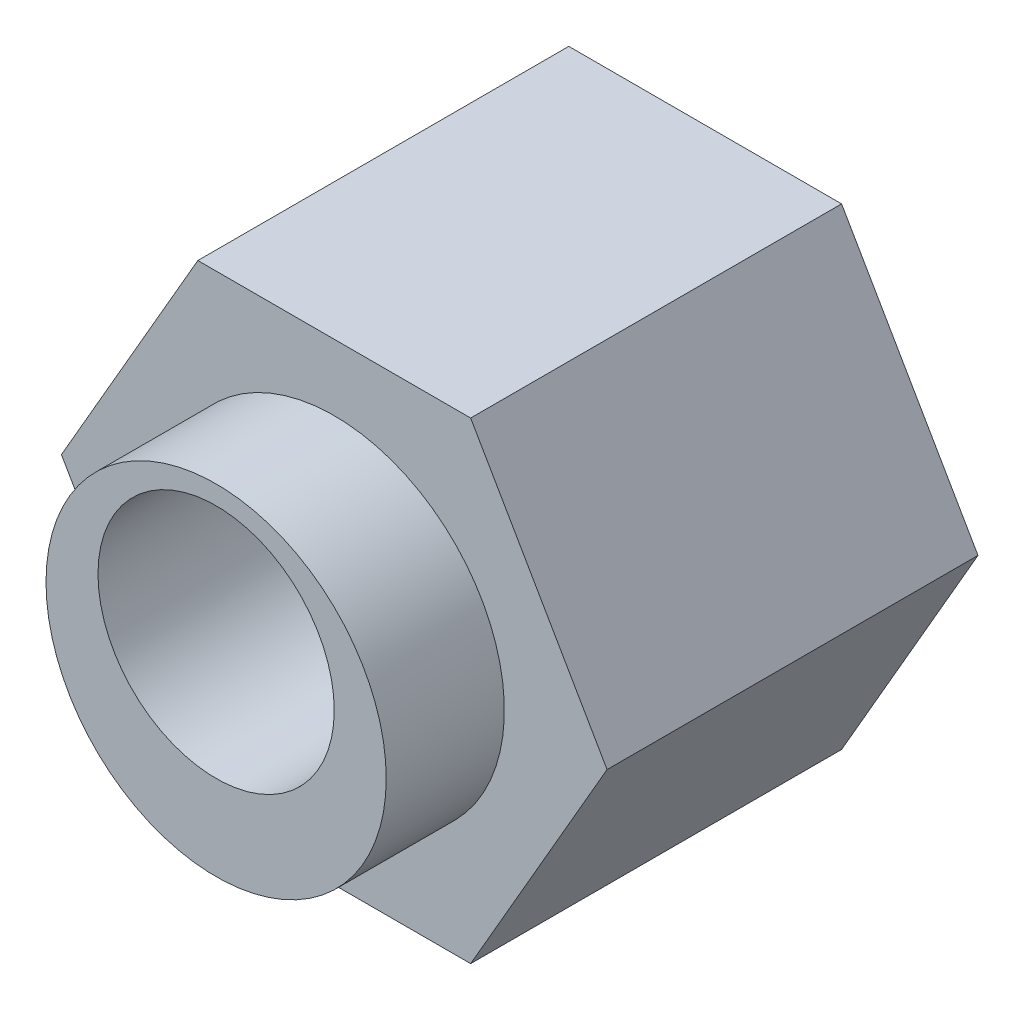
ISO-10303-21;
HEADER;
FILE_DESCRIPTION(('STEP AP214'),'2;1');
FILE_NAME('part.step','',(''),(''),'','','');
FILE_SCHEMA(('AUTOMOTIVE_DESIGN { 1 0 10303 214 1 1 1 1 }'));
ENDSEC;
DATA;
#1=APPLICATION_CONTEXT('core data for automotive mechanical design processes');
#2=APPLICATION_PROTOCOL_DEFINITION('international standard','automotive_design',2000,#1);
#3=PRODUCT_CONTEXT('',#1,'mechanical');
#4=PRODUCT('Part','Part','',(#3));
#5=PRODUCT_RELATED_PRODUCT_CATEGORY('part','',(#4));
#6=PRODUCT_DEFINITION_FORMATION('','',#4);
#7=PRODUCT_DEFINITION_CONTEXT('part definition',#1,'design');
#8=PRODUCT_DEFINITION('design','',#6,#7);
#9=PRODUCT_DEFINITION_SHAPE('','',#8);
#10=(LENGTH_UNIT() NAMED_UNIT(*) SI_UNIT(.MILLI.,.METRE.));
#11=(NAMED_UNIT(*) PLANE_ANGLE_UNIT() SI_UNIT($,.RADIAN.));
#12=(NAMED_UNIT(*) SI_UNIT($,.STERADIAN.) SOLID_ANGLE_UNIT());
#13=UNCERTAINTY_MEASURE_WITH_UNIT(LENGTH_MEASURE(1.E-05),#10,'distance_accuracy_value','');
#14=(GEOMETRIC_REPRESENTATION_CONTEXT(3) GLOBAL_UNCERTAINTY_ASSIGNED_CONTEXT((#13)) GLOBAL_UNIT_ASSIGNED_CONTEXT((#10,
#11,#12)) REPRESENTATION_CONTEXT('',''));
#15=CARTESIAN_POINT('',(0.,0.,0.));
#16=DIRECTION('',(0.,0.,1.));
#17=DIRECTION('',(1.,0.,0.));
#18=AXIS2_PLACEMENT_3D('',#15,#16,#17);
#19=CARTESIAN_POINT('',(2.88675134594813,-5.,8.3));
#20=DIRECTION('',(0.,-1.,0.));
#21=DIRECTION('',(0.,0.,-1.));
#22=AXIS2_PLACEMENT_3D('',#19,#20,#21);
#23=PLANE('',#22);
#24=DIRECTION('',(-1.,0.,0.));
#25=VECTOR('',#24,1.);
#26=CARTESIAN_POINT('',(2.88675134594813,-5.,0.45));
#27=LINE('',#26,#25);
#28=CARTESIAN_POINT('',(2.88675134594813,-5.,0.45));
#29=VERTEX_POINT('',#28);
#30=CARTESIAN_POINT('',(-2.88675134594813,-5.,0.45));
#31=VERTEX_POINT('',#30);
#32=EDGE_CURVE('E120',#29,#31,#27,.T.);
#33=ORIENTED_EDGE('',*,*,#32,.F.);
#34=DIRECTION('',(0.,0.,-1.));
#35=VECTOR('',#34,1.);
#36=CARTESIAN_POINT('',(2.88675134594813,-5.,8.3));
#37=LINE('',#36,#35);
#38=CARTESIAN_POINT('',(2.88675134594813,-5.,8.3));
#39=VERTEX_POINT('',#38);
#40=EDGE_CURVE('E42',#39,#29,#37,.T.);
#41=ORIENTED_EDGE('',*,*,#40,.F.);
#42=DIRECTION('',(-1.,0.,0.));
#43=VECTOR('',#42,1.);
#44=CARTESIAN_POINT('',(2.88675134594813,-5.,8.3));
#45=LINE('',#44,#43);
#46=CARTESIAN_POINT('',(-2.88675134594813,-5.,8.3));
#47=VERTEX_POINT('',#46);
#48=EDGE_CURVE('E136',#39,#47,#45,.T.);
#49=ORIENTED_EDGE('',*,*,#48,.T.);
#50=DIRECTION('',(0.,0.,-1.));
#51=VECTOR('',#50,1.);
#52=CARTESIAN_POINT('',(-2.88675134594813,-5.,8.3));
#53=LINE('',#52,#51);
#54=EDGE_CURVE('E84',#47,#31,#53,.T.);
#55=ORIENTED_EDGE('',*,*,#54,.T.);
#56=EDGE_LOOP('',(#33,#41,#49,#55));
#57=FACE_BOUND('',#56,.T.);
#58=ADVANCED_FACE('F34',(#57),#23,.T.);
#59=CARTESIAN_POINT('',(5.77350269189626,0.,8.3));
#60=DIRECTION('',(0.866025403784438,-0.500000000000001,0.));
#61=DIRECTION('',(0.500000000000001,0.866025403784438,0.));
#62=AXIS2_PLACEMENT_3D('',#59,#60,#61);
#63=PLANE('',#62);
#64=DIRECTION('',(-0.500000000000001,-0.866025403784438,0.));
#65=VECTOR('',#64,1.);
#66=CARTESIAN_POINT('',(5.77350269189626,0.,0.45));
#67=LINE('',#66,#65);
#68=CARTESIAN_POINT('',(5.77350269189626,0.,0.45));
#69=VERTEX_POINT('',#68);
#70=EDGE_CURVE('E133',#69,#29,#67,.T.);
#71=ORIENTED_EDGE('',*,*,#70,.F.);
#72=DIRECTION('',(0.,0.,-1.));
#73=VECTOR('',#72,1.);
#74=CARTESIAN_POINT('',(5.77350269189626,0.,8.3));
#75=LINE('',#74,#73);
#76=CARTESIAN_POINT('',(5.77350269189626,0.,8.3));
#77=VERTEX_POINT('',#76);
#78=EDGE_CURVE('E72',#77,#69,#75,.T.);
#79=ORIENTED_EDGE('',*,*,#78,.F.);
#80=DIRECTION('',(-0.500000000000001,-0.866025403784438,0.));
#81=VECTOR('',#80,1.);
#82=CARTESIAN_POINT('',(5.77350269189626,0.,8.3));
#83=LINE('',#82,#81);
#84=EDGE_CURVE('E110',#77,#39,#83,.T.);
#85=ORIENTED_EDGE('',*,*,#84,.T.);
#86=ORIENTED_EDGE('',*,*,#40,.T.);
#87=EDGE_LOOP('',(#71,#79,#85,#86));
#88=FACE_BOUND('',#87,.T.);
#89=ADVANCED_FACE('F145',(#88),#63,.T.);
#90=CARTESIAN_POINT('',(2.88675134594813,5.,8.3));
#91=DIRECTION('',(0.866025403784438,0.5,0.));
#92=DIRECTION('',(-0.5,0.866025403784439,0.));
#93=AXIS2_PLACEMENT_3D('',#90,#91,#92);
#94=PLANE('',#93);
#95=DIRECTION('',(0.5,-0.866025403784439,0.));
#96=VECTOR('',#95,1.);
#97=CARTESIAN_POINT('',(2.88675134594813,5.,0.45));
#98=LINE('',#97,#96);
#99=CARTESIAN_POINT('',(2.88675134594813,5.,0.45));
#100=VERTEX_POINT('',#99);
#101=EDGE_CURVE('E97',#100,#69,#98,.T.);
#102=ORIENTED_EDGE('',*,*,#101,.F.);
#103=DIRECTION('',(0.,0.,-1.));
#104=VECTOR('',#103,1.);
#105=CARTESIAN_POINT('',(2.88675134594813,5.,8.3));
#106=LINE('',#105,#104);
#107=CARTESIAN_POINT('',(2.88675134594813,5.,8.3));
#108=VERTEX_POINT('',#107);
#109=EDGE_CURVE('E92',#108,#100,#106,.T.);
#110=ORIENTED_EDGE('',*,*,#109,.F.);
#111=DIRECTION('',(0.5,-0.866025403784439,0.));
#112=VECTOR('',#111,1.);
#113=CARTESIAN_POINT('',(2.88675134594813,5.,8.3));
#114=LINE('',#113,#112);
#115=EDGE_CURVE('E95',#108,#77,#114,.T.);
#116=ORIENTED_EDGE('',*,*,#115,.T.);
#117=ORIENTED_EDGE('',*,*,#78,.T.);
#118=EDGE_LOOP('',(#102,#110,#116,#117));
#119=FACE_BOUND('',#118,.T.);
#120=ADVANCED_FACE('F94',(#119),#94,.T.);
#121=CARTESIAN_POINT('',(-2.88675134594813,5.,8.3));
#122=DIRECTION('',(0.,1.,0.));
#123=DIRECTION('',(-1.,0.,0.));
#124=AXIS2_PLACEMENT_3D('',#121,#122,#123);
#125=PLANE('',#124);
#126=DIRECTION('',(1.,0.,0.));
#127=VECTOR('',#126,1.);
#128=CARTESIAN_POINT('',(-2.88675134594813,5.,0.45));
#129=LINE('',#128,#127);
#130=CARTESIAN_POINT('',(-2.88675134594813,5.,0.45));
#131=VERTEX_POINT('',#130);
#132=EDGE_CURVE('E130',#131,#100,#129,.T.);
#133=ORIENTED_EDGE('',*,*,#132,.F.);
#134=DIRECTION('',(0.,0.,-1.));
#135=VECTOR('',#134,1.);
#136=CARTESIAN_POINT('',(-2.88675134594813,5.,8.3));
#137=LINE('',#136,#135);
#138=CARTESIAN_POINT('',(-2.88675134594813,5.,8.3));
#139=VERTEX_POINT('',#138);
#140=EDGE_CURVE('E102',#139,#131,#137,.T.);
#141=ORIENTED_EDGE('',*,*,#140,.F.);
#142=DIRECTION('',(1.,0.,0.));
#143=VECTOR('',#142,1.);
#144=CARTESIAN_POINT('',(-2.88675134594813,5.,8.3));
#145=LINE('',#144,#143);
#146=EDGE_CURVE('E108',#139,#108,#145,.T.);
#147=ORIENTED_EDGE('',*,*,#146,.T.);
#148=ORIENTED_EDGE('',*,*,#109,.T.);
#149=EDGE_LOOP('',(#133,#141,#147,#148));
#150=FACE_BOUND('',#149,.T.);
#151=ADVANCED_FACE('F112',(#150),#125,.T.);
#152=CARTESIAN_POINT('',(-5.77350269189626,0.,8.3));
#153=DIRECTION('',(-0.866025403784438,0.500000000000001,0.));
#154=DIRECTION('',(-0.500000000000001,-0.866025403784438,0.));
#155=AXIS2_PLACEMENT_3D('',#152,#153,#154);
#156=PLANE('',#155);
#157=DIRECTION('',(0.500000000000001,0.866025403784438,0.));
#158=VECTOR('',#157,1.);
#159=CARTESIAN_POINT('',(-5.77350269189626,0.,0.45));
#160=LINE('',#159,#158);
#161=CARTESIAN_POINT('',(-5.77350269189626,0.,0.45));
#162=VERTEX_POINT('',#161);
#163=EDGE_CURVE('E127',#162,#131,#160,.T.);
#164=ORIENTED_EDGE('',*,*,#163,.F.);
#165=DIRECTION('',(0.,0.,-1.));
#166=VECTOR('',#165,1.);
#167=CARTESIAN_POINT('',(-5.77350269189626,0.,8.3));
#168=LINE('',#167,#166);
#169=CARTESIAN_POINT('',(-5.77350269189626,0.,8.3));
#170=VERTEX_POINT('',#169);
#171=EDGE_CURVE('E140',#170,#162,#168,.T.);
#172=ORIENTED_EDGE('',*,*,#171,.F.);
#173=DIRECTION('',(0.500000000000001,0.866025403784438,0.));
#174=VECTOR('',#173,1.);
#175=CARTESIAN_POINT('',(-5.77350269189626,0.,8.3));
#176=LINE('',#175,#174);
#177=EDGE_CURVE('E113',#170,#139,#176,.T.);
#178=ORIENTED_EDGE('',*,*,#177,.T.);
#179=ORIENTED_EDGE('',*,*,#140,.T.);
#180=EDGE_LOOP('',(#164,#172,#178,#179));
#181=FACE_BOUND('',#180,.T.);
#182=ADVANCED_FACE('F158',(#181),#156,.T.);
#183=CARTESIAN_POINT('',(-2.88675134594813,-5.,8.3));
#184=DIRECTION('',(-0.866025403784438,-0.5,0.));
#185=DIRECTION('',(0.5,-0.866025403784439,0.));
#186=AXIS2_PLACEMENT_3D('',#183,#184,#185);
#187=PLANE('',#186);
#188=DIRECTION('',(-0.5,0.866025403784439,0.));
#189=VECTOR('',#188,1.);
#190=CARTESIAN_POINT('',(-2.88675134594813,-5.,0.45));
#191=LINE('',#190,#189);
#192=EDGE_CURVE('E123',#31,#162,#191,.T.);
#193=ORIENTED_EDGE('',*,*,#192,.F.);
#194=ORIENTED_EDGE('',*,*,#54,.F.);
#195=DIRECTION('',(-0.5,0.866025403784439,0.));
#196=VECTOR('',#195,1.);
#197=CARTESIAN_POINT('',(-2.88675134594813,-5.,8.3));
#198=LINE('',#197,#196);
#199=EDGE_CURVE('E115',#47,#170,#198,.T.);
#200=ORIENTED_EDGE('',*,*,#199,.T.);
#201=ORIENTED_EDGE('',*,*,#171,.T.);
#202=EDGE_LOOP('',(#193,#194,#200,#201));
#203=FACE_BOUND('',#202,.T.);
#204=ADVANCED_FACE('F141',(#203),#187,.T.);
#205=CARTESIAN_POINT('',(0.,0.,8.3));
#206=DIRECTION('',(0.,0.,-1.));
#207=DIRECTION('',(-1.,0.,0.));
#208=AXIS2_PLACEMENT_3D('',#205,#206,#207);
#209=PLANE('',#208);
#210=CARTESIAN_POINT('',(0.,0.,8.3));
#211=DIRECTION('',(0.,0.,-1.));
#212=DIRECTION('',(-1.,0.,0.));
#213=AXIS2_PLACEMENT_3D('',#210,#211,#212);
#214=CIRCLE('',#213,3.6);
#215=CARTESIAN_POINT('',(-3.6,0.,8.3));
#216=VERTEX_POINT('',#215);
#217=EDGE_CURVE('E11',#216,#216,#214,.F.);
#218=ORIENTED_EDGE('',*,*,#217,.F.);
#219=EDGE_LOOP('',(#218));
#220=FACE_BOUND('',#219,.T.);
#221=ORIENTED_EDGE('',*,*,#48,.F.);
#222=ORIENTED_EDGE('',*,*,#84,.F.);
#223=ORIENTED_EDGE('',*,*,#115,.F.);
#224=ORIENTED_EDGE('',*,*,#146,.F.);
#225=ORIENTED_EDGE('',*,*,#177,.F.);
#226=ORIENTED_EDGE('',*,*,#199,.F.);
#227=EDGE_LOOP('',(#221,#222,#223,#224,#225,#226));
#228=FACE_BOUND('',#227,.T.);
#229=ADVANCED_FACE('F106',(#220,#228),#209,.F.);
#230=CARTESIAN_POINT('',(0.,0.,0.45));
#231=DIRECTION('',(0.,0.,-1.));
#232=DIRECTION('',(-1.,0.,0.));
#233=AXIS2_PLACEMENT_3D('',#230,#231,#232);
#234=PLANE('',#233);
#235=CARTESIAN_POINT('',(0.,0.,0.45));
#236=DIRECTION('',(0.,0.,-1.));
#237=DIRECTION('',(-1.,0.,0.));
#238=AXIS2_PLACEMENT_3D('',#235,#236,#237);
#239=CIRCLE('',#238,3.6);
#240=CARTESIAN_POINT('',(-3.6,0.,0.45));
#241=VERTEX_POINT('',#240);
#242=EDGE_CURVE('E201',#241,#241,#239,.T.);
#243=ORIENTED_EDGE('',*,*,#242,.F.);
#244=EDGE_LOOP('',(#243));
#245=FACE_BOUND('',#244,.T.);
#246=ORIENTED_EDGE('',*,*,#32,.T.);
#247=ORIENTED_EDGE('',*,*,#192,.T.);
#248=ORIENTED_EDGE('',*,*,#163,.T.);
#249=ORIENTED_EDGE('',*,*,#132,.T.);
#250=ORIENTED_EDGE('',*,*,#101,.T.);
#251=ORIENTED_EDGE('',*,*,#70,.T.);
#252=EDGE_LOOP('',(#246,#247,#248,#249,#250,#251));
#253=FACE_BOUND('',#252,.T.);
#254=ADVANCED_FACE('F144',(#245,#253),#234,.T.);
#255=CARTESIAN_POINT('',(0.,0.,10.8));
#256=DIRECTION('',(0.,0.,1.));
#257=DIRECTION('',(1.,0.,0.));
#258=AXIS2_PLACEMENT_3D('',#255,#256,#257);
#259=PLANE('',#258);
#260=CARTESIAN_POINT('',(0.,0.,10.8));
#261=DIRECTION('',(0.,0.,1.));
#262=DIRECTION('',(1.,0.,0.));
#263=AXIS2_PLACEMENT_3D('',#260,#261,#262);
#264=CIRCLE('',#263,3.6);
#265=CARTESIAN_POINT('',(3.6,0.,10.8));
#266=VERTEX_POINT('',#265);
#267=EDGE_CURVE('E124',#266,#266,#264,.T.);
#268=ORIENTED_EDGE('',*,*,#267,.T.);
#269=EDGE_LOOP('',(#268));
#270=FACE_BOUND('',#269,.T.);
#271=CARTESIAN_POINT('',(0.,0.7,10.8));
#272=DIRECTION('',(0.,0.,1.));
#273=DIRECTION('',(1.,0.,0.));
#274=AXIS2_PLACEMENT_3D('',#271,#272,#273);
#275=CIRCLE('',#274,2.49999999999998);
#276=CARTESIAN_POINT('',(2.49999999999998,0.7,10.8));
#277=VERTEX_POINT('',#276);
#278=EDGE_CURVE('E206',#277,#277,#275,.T.);
#279=ORIENTED_EDGE('',*,*,#278,.F.);
#280=EDGE_LOOP('',(#279));
#281=FACE_BOUND('',#280,.T.);
#282=ADVANCED_FACE('F169',(#270,#281),#259,.T.);
#283=CARTESIAN_POINT('',(0.,0.,10.8));
#284=DIRECTION('',(0.,0.,-1.));
#285=DIRECTION('',(-1.,0.,0.));
#286=AXIS2_PLACEMENT_3D('',#283,#284,#285);
#287=CYLINDRICAL_SURFACE('',#286,3.6);
#288=ORIENTED_EDGE('',*,*,#267,.F.);
#289=EDGE_LOOP('',(#288));
#290=FACE_BOUND('',#289,.T.);
#291=ORIENTED_EDGE('',*,*,#217,.T.);
#292=EDGE_LOOP('',(#291));
#293=FACE_BOUND('',#292,.T.);
#294=ADVANCED_FACE('F173',(#290,#293),#287,.T.);
#295=CARTESIAN_POINT('',(0.,0.7,10.8));
#296=DIRECTION('',(0.,0.,-1.));
#297=DIRECTION('',(-1.,0.,0.));
#298=AXIS2_PLACEMENT_3D('',#295,#296,#297);
#299=CYLINDRICAL_SURFACE('',#298,2.49999999999998);
#300=ORIENTED_EDGE('',*,*,#278,.T.);
#301=EDGE_LOOP('',(#300));
#302=FACE_BOUND('',#301,.T.);
#303=CARTESIAN_POINT('',(0.,0.7,-0.0499999999999997));
#304=DIRECTION('',(0.,0.,-1.));
#305=DIRECTION('',(-1.,0.,0.));
#306=AXIS2_PLACEMENT_3D('',#303,#304,#305);
#307=CIRCLE('',#306,2.49999999999998);
#308=CARTESIAN_POINT('',(-2.49999999999998,0.7,-0.0499999999999997));
#309=VERTEX_POINT('',#308);
#310=EDGE_CURVE('E199',#309,#309,#307,.T.);
#311=ORIENTED_EDGE('',*,*,#310,.T.);
#312=EDGE_LOOP('',(#311));
#313=FACE_BOUND('',#312,.T.);
#314=ADVANCED_FACE('F176',(#302,#313),#299,.F.);
#315=CARTESIAN_POINT('',(0.,0.,-0.0499999999999997));
#316=DIRECTION('',(0.,0.,-1.));
#317=DIRECTION('',(-1.,0.,0.));
#318=AXIS2_PLACEMENT_3D('',#315,#316,#317);
#319=PLANE('',#318);
#320=CARTESIAN_POINT('',(0.,0.,-0.0499999999999997));
#321=DIRECTION('',(0.,0.,-1.));
#322=DIRECTION('',(-1.,0.,0.));
#323=AXIS2_PLACEMENT_3D('',#320,#321,#322);
#324=CIRCLE('',#323,3.6);
#325=CARTESIAN_POINT('',(-3.6,0.,-0.0499999999999997));
#326=VERTEX_POINT('',#325);
#327=EDGE_CURVE('E196',#326,#326,#324,.T.);
#328=ORIENTED_EDGE('',*,*,#327,.T.);
#329=EDGE_LOOP('',(#328));
#330=FACE_BOUND('',#329,.T.);
#331=ORIENTED_EDGE('',*,*,#310,.F.);
#332=EDGE_LOOP('',(#331));
#333=FACE_BOUND('',#332,.T.);
#334=ADVANCED_FACE('F183',(#330,#333),#319,.T.);
#335=CARTESIAN_POINT('',(0.,0.,-0.0499999999999997));
#336=DIRECTION('',(0.,0.,1.));
#337=DIRECTION('',(1.,0.,0.));
#338=AXIS2_PLACEMENT_3D('',#335,#336,#337);
#339=CYLINDRICAL_SURFACE('',#338,3.6);
#340=ORIENTED_EDGE('',*,*,#327,.F.);
#341=EDGE_LOOP('',(#340));
#342=FACE_BOUND('',#341,.T.);
#343=ORIENTED_EDGE('',*,*,#242,.T.);
#344=EDGE_LOOP('',(#343));
#345=FACE_BOUND('',#344,.T.);
#346=ADVANCED_FACE('F185',(#342,#345),#339,.T.);
#347=CLOSED_SHELL('',(#58,#89,#120,#151,#182,#204,#229,#254,#282,#294,#314,#334,#346));
#348=MANIFOLD_SOLID_BREP('B2',#347);
#349=ADVANCED_BREP_SHAPE_REPRESENTATION('',(#18,#348),#14);
#350=SHAPE_DEFINITION_REPRESENTATION(#9,#349);
ENDSEC;
END-ISO-10303-21;
